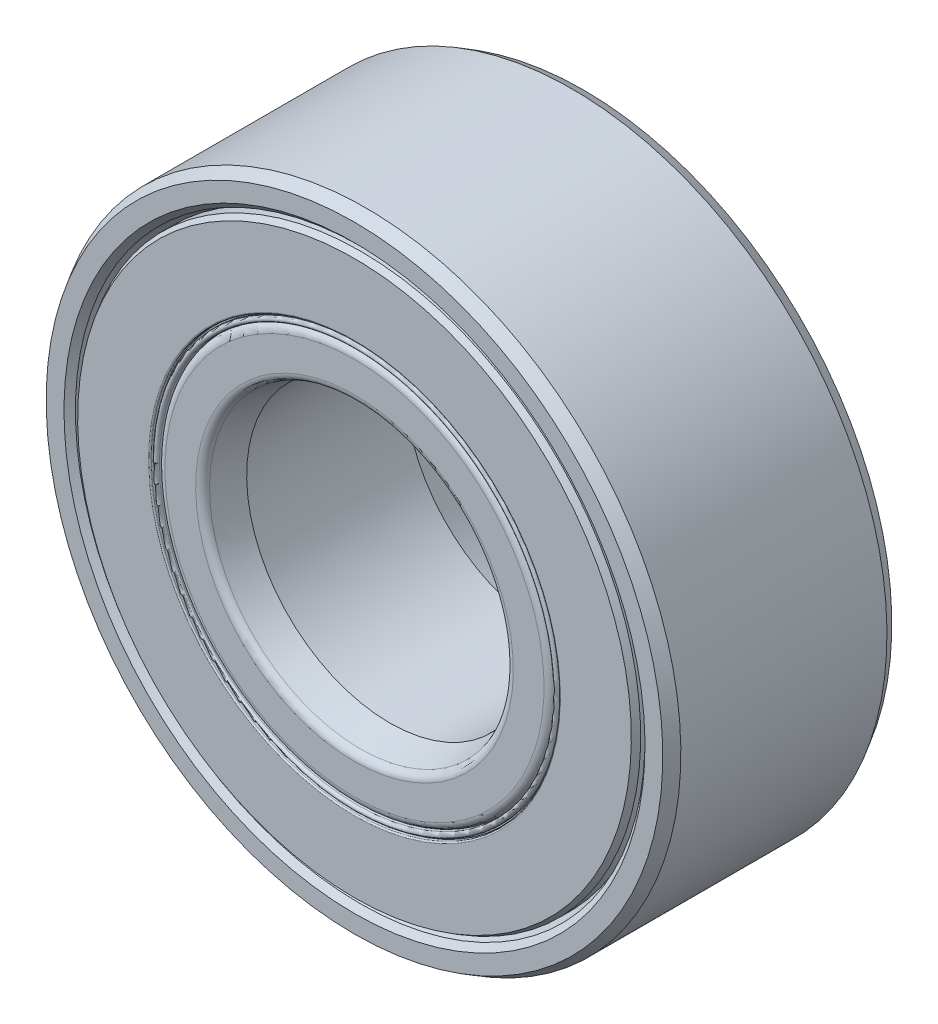
ISO-10303-21;
HEADER;
FILE_DESCRIPTION(('STEP AP214'),'2;1');
FILE_NAME('part.step','',(''),(''),'','','');
FILE_SCHEMA(('AUTOMOTIVE_DESIGN { 1 0 10303 214 1 1 1 1 }'));
ENDSEC;
DATA;
#1=APPLICATION_CONTEXT('core data for automotive mechanical design processes');
#2=APPLICATION_PROTOCOL_DEFINITION('international standard','automotive_design',2000,#1);
#3=PRODUCT_CONTEXT('',#1,'mechanical');
#4=PRODUCT('Part','Part','',(#3));
#5=PRODUCT_RELATED_PRODUCT_CATEGORY('part','',(#4));
#6=PRODUCT_DEFINITION_FORMATION('','',#4);
#7=PRODUCT_DEFINITION_CONTEXT('part definition',#1,'design');
#8=PRODUCT_DEFINITION('design','',#6,#7);
#9=PRODUCT_DEFINITION_SHAPE('','',#8);
#10=(LENGTH_UNIT() NAMED_UNIT(*) SI_UNIT(.MILLI.,.METRE.));
#11=(NAMED_UNIT(*) PLANE_ANGLE_UNIT() SI_UNIT($,.RADIAN.));
#12=(NAMED_UNIT(*) SI_UNIT($,.STERADIAN.) SOLID_ANGLE_UNIT());
#13=UNCERTAINTY_MEASURE_WITH_UNIT(LENGTH_MEASURE(1.E-05),#10,'distance_accuracy_value','');
#14=(GEOMETRIC_REPRESENTATION_CONTEXT(3) GLOBAL_UNCERTAINTY_ASSIGNED_CONTEXT((#13)) GLOBAL_UNIT_ASSIGNED_CONTEXT((#10,
#11,#12)) REPRESENTATION_CONTEXT('',''));
#15=CARTESIAN_POINT('',(0.,0.,0.));
#16=DIRECTION('',(0.,0.,1.));
#17=DIRECTION('',(1.,0.,0.));
#18=AXIS2_PLACEMENT_3D('',#15,#16,#17);
#19=CARTESIAN_POINT('',(0.,3.45166666666666,1.125));
#20=DIRECTION('',(0.,0.,1.));
#21=DIRECTION('',(0.,-1.,0.));
#22=AXIS2_PLACEMENT_3D('',#19,#20,#21);
#23=PLANE('',#22);
#24=CARTESIAN_POINT('',(0.,0.,1.125));
#25=DIRECTION('',(0.,0.,1.));
#26=DIRECTION('',(0.,-1.,0.));
#27=AXIS2_PLACEMENT_3D('',#24,#25,#26);
#28=CIRCLE('',#27,3.57166666666666);
#29=CARTESIAN_POINT('',(0.,-3.57166666666666,1.125));
#30=VERTEX_POINT('',#29);
#31=EDGE_CURVE('E11',#30,#30,#28,.T.);
#32=ORIENTED_EDGE('',*,*,#31,.F.);
#33=EDGE_LOOP('',(#32));
#34=FACE_BOUND('',#33,.T.);
#35=CARTESIAN_POINT('',(0.,0.,1.125));
#36=DIRECTION('',(0.,0.,1.));
#37=DIRECTION('',(0.,-1.,0.));
#38=AXIS2_PLACEMENT_3D('',#35,#36,#37);
#39=CIRCLE('',#38,3.45166666666666);
#40=CARTESIAN_POINT('',(0.,-3.45166666666666,1.125));
#41=VERTEX_POINT('',#40);
#42=EDGE_CURVE('E75',#41,#41,#39,.T.);
#43=ORIENTED_EDGE('',*,*,#42,.T.);
#44=EDGE_LOOP('',(#43));
#45=FACE_BOUND('',#44,.T.);
#46=ADVANCED_FACE('F50',(#34,#45),#23,.F.);
#47=CARTESIAN_POINT('',(0.,0.,2.));
#48=DIRECTION('',(0.,0.,1.));
#49=DIRECTION('',(0.,-1.,0.));
#50=AXIS2_PLACEMENT_3D('',#47,#48,#49);
#51=CYLINDRICAL_SURFACE('',#50,3.57166666666666);
#52=CARTESIAN_POINT('',(0.,0.,1.90262465990578));
#53=DIRECTION('',(0.,0.,1.));
#54=DIRECTION('',(0.,-1.,0.));
#55=AXIS2_PLACEMENT_3D('',#52,#53,#54);
#56=CIRCLE('',#55,3.57166666666667);
#57=CARTESIAN_POINT('',(0.,-3.57166666666667,1.90262465990577));
#58=VERTEX_POINT('',#57);
#59=EDGE_CURVE('E56',#58,#58,#56,.T.);
#60=ORIENTED_EDGE('',*,*,#59,.F.);
#61=EDGE_LOOP('',(#60));
#62=FACE_BOUND('',#61,.T.);
#63=ORIENTED_EDGE('',*,*,#31,.T.);
#64=EDGE_LOOP('',(#63));
#65=FACE_BOUND('',#64,.T.);
#66=ADVANCED_FACE('F106',(#62,#65),#51,.T.);
#67=CARTESIAN_POINT('',(0.,0.,1.90262465990578));
#68=DIRECTION('',(0.,0.,-1.));
#69=DIRECTION('',(0.,1.,0.));
#70=AXIS2_PLACEMENT_3D('',#67,#68,#69);
#71=CONICAL_SURFACE('',#70,3.57166666666667,0.174532925199437);
#72=CARTESIAN_POINT('',(0.,0.,1.93216889249614));
#73=DIRECTION('',(0.,0.,1.));
#74=DIRECTION('',(0.,-1.,0.));
#75=AXIS2_PLACEMENT_3D('',#72,#73,#74);
#76=CIRCLE('',#75,3.56645722133666);
#77=CARTESIAN_POINT('',(0.,-3.56645722133666,1.93216889249614));
#78=VERTEX_POINT('',#77);
#79=EDGE_CURVE('E60',#78,#78,#76,.T.);
#80=ORIENTED_EDGE('',*,*,#79,.F.);
#81=EDGE_LOOP('',(#80));
#82=FACE_BOUND('',#81,.T.);
#83=ORIENTED_EDGE('',*,*,#59,.T.);
#84=EDGE_LOOP('',(#83));
#85=FACE_BOUND('',#84,.T.);
#86=ADVANCED_FACE('F101',(#82,#85),#71,.T.);
#87=CARTESIAN_POINT('',(0.,0.,1.93));
#88=DIRECTION('',(0.,0.,1.));
#89=DIRECTION('',(0.,-1.,0.));
#90=AXIS2_PLACEMENT_3D('',#87,#88,#89);
#91=TOROIDAL_SURFACE('',#90,3.55415682075457,0.0124901540879055);
#92=CARTESIAN_POINT('',(0.,0.,1.93));
#93=DIRECTION('',(0.,0.,1.));
#94=DIRECTION('',(0.,-1.,0.));
#95=AXIS2_PLACEMENT_3D('',#92,#93,#94);
#96=CIRCLE('',#95,3.54166666666667);
#97=CARTESIAN_POINT('',(0.,-3.54166666666667,1.93));
#98=VERTEX_POINT('',#97);
#99=EDGE_CURVE('E64',#98,#98,#96,.T.);
#100=ORIENTED_EDGE('',*,*,#99,.F.);
#101=EDGE_LOOP('',(#100));
#102=FACE_BOUND('',#101,.T.);
#103=ORIENTED_EDGE('',*,*,#79,.T.);
#104=EDGE_LOOP('',(#103));
#105=FACE_BOUND('',#104,.T.);
#106=ADVANCED_FACE('F95',(#102,#105),#91,.T.);
#107=CARTESIAN_POINT('',(0.,0.,2.));
#108=DIRECTION('',(0.,0.,1.));
#109=DIRECTION('',(0.,-1.,0.));
#110=AXIS2_PLACEMENT_3D('',#107,#108,#109);
#111=CYLINDRICAL_SURFACE('',#110,3.54166666666667);
#112=CARTESIAN_POINT('',(0.,0.,1.955));
#113=DIRECTION('',(0.,0.,1.));
#114=DIRECTION('',(0.,-1.,0.));
#115=AXIS2_PLACEMENT_3D('',#112,#113,#114);
#116=CIRCLE('',#115,3.54166666666667);
#117=CARTESIAN_POINT('',(0.,-3.54166666666667,1.955));
#118=VERTEX_POINT('',#117);
#119=EDGE_CURVE('E69',#118,#118,#116,.T.);
#120=ORIENTED_EDGE('',*,*,#119,.F.);
#121=EDGE_LOOP('',(#120));
#122=FACE_BOUND('',#121,.T.);
#123=ORIENTED_EDGE('',*,*,#99,.T.);
#124=EDGE_LOOP('',(#123));
#125=FACE_BOUND('',#124,.T.);
#126=ADVANCED_FACE('F89',(#122,#125),#111,.T.);
#127=CARTESIAN_POINT('',(0.,0.,1.955));
#128=DIRECTION('',(0.,0.,1.));
#129=DIRECTION('',(0.,-1.,0.));
#130=AXIS2_PLACEMENT_3D('',#127,#128,#129);
#131=TOROIDAL_SURFACE('',#130,3.49666666666667,0.0449999999999999);
#132=CARTESIAN_POINT('',(0.,0.,1.955));
#133=DIRECTION('',(0.,0.,1.));
#134=DIRECTION('',(0.,-1.,0.));
#135=AXIS2_PLACEMENT_3D('',#132,#133,#134);
#136=CIRCLE('',#135,3.45166666666667);
#137=CARTESIAN_POINT('',(0.,-3.45166666666667,1.955));
#138=VERTEX_POINT('',#137);
#139=EDGE_CURVE('E72',#138,#138,#136,.T.);
#140=ORIENTED_EDGE('',*,*,#139,.F.);
#141=EDGE_LOOP('',(#140));
#142=FACE_BOUND('',#141,.T.);
#143=ORIENTED_EDGE('',*,*,#119,.T.);
#144=EDGE_LOOP('',(#143));
#145=FACE_BOUND('',#144,.T.);
#146=ADVANCED_FACE('F83',(#142,#145),#131,.T.);
#147=CARTESIAN_POINT('',(0.,0.,2.));
#148=DIRECTION('',(0.,0.,1.));
#149=DIRECTION('',(0.,-1.,0.));
#150=AXIS2_PLACEMENT_3D('',#147,#148,#149);
#151=CYLINDRICAL_SURFACE('',#150,3.45166666666667);
#152=ORIENTED_EDGE('',*,*,#42,.F.);
#153=EDGE_LOOP('',(#152));
#154=FACE_BOUND('',#153,.T.);
#155=ORIENTED_EDGE('',*,*,#139,.T.);
#156=EDGE_LOOP('',(#155));
#157=FACE_BOUND('',#156,.T.);
#158=ADVANCED_FACE('F80',(#154,#157),#151,.F.);
#159=CLOSED_SHELL('',(#46,#66,#86,#106,#126,#146,#158));
#160=MANIFOLD_SOLID_BREP('B2',#159);
#161=CARTESIAN_POINT('',(0.,0.,-2.));
#162=DIRECTION('',(0.,0.,1.));
#163=DIRECTION('',(0.,-1.,0.));
#164=AXIS2_PLACEMENT_3D('',#161,#162,#163);
#165=CONICAL_SURFACE('',#164,4.835,0.523598775598299);
#166=CARTESIAN_POINT('',(0.,0.,-1.89607695154587));
#167=DIRECTION('',(0.,0.,1.));
#168=DIRECTION('',(0.,-1.,0.));
#169=AXIS2_PLACEMENT_3D('',#166,#167,#168);
#170=CIRCLE('',#169,4.895);
#171=CARTESIAN_POINT('',(0.,-4.895,-1.89607695154587));
#172=VERTEX_POINT('',#171);
#173=EDGE_CURVE('E187',#172,#172,#170,.T.);
#174=ORIENTED_EDGE('',*,*,#173,.F.);
#175=EDGE_LOOP('',(#174));
#176=FACE_BOUND('',#175,.T.);
#177=CARTESIAN_POINT('',(0.,0.,-2.));
#178=DIRECTION('',(0.,0.,1.));
#179=DIRECTION('',(0.,-1.,0.));
#180=AXIS2_PLACEMENT_3D('',#177,#178,#179);
#181=CIRCLE('',#180,4.835);
#182=CARTESIAN_POINT('',(0.,-4.835,-2.));
#183=VERTEX_POINT('',#182);
#184=EDGE_CURVE('E49',#183,#183,#181,.T.);
#185=ORIENTED_EDGE('',*,*,#184,.T.);
#186=EDGE_LOOP('',(#185));
#187=FACE_BOUND('',#186,.T.);
#188=ADVANCED_FACE('F165',(#176,#187),#165,.T.);
#189=CARTESIAN_POINT('',(0.,4.835,-2.));
#190=DIRECTION('',(0.,0.,1.));
#191=DIRECTION('',(0.,-1.,0.));
#192=AXIS2_PLACEMENT_3D('',#189,#190,#191);
#193=PLANE('',#192);
#194=ORIENTED_EDGE('',*,*,#184,.F.);
#195=EDGE_LOOP('',(#194));
#196=FACE_BOUND('',#195,.T.);
#197=CARTESIAN_POINT('',(0.,0.,-2.));
#198=DIRECTION('',(0.,0.,1.));
#199=DIRECTION('',(0.,-1.,0.));
#200=AXIS2_PLACEMENT_3D('',#197,#198,#199);
#201=CIRCLE('',#200,3.59566666666667);
#202=CARTESIAN_POINT('',(0.,-3.59566666666666,-2.));
#203=VERTEX_POINT('',#202);
#204=EDGE_CURVE('E171',#203,#203,#201,.T.);
#205=ORIENTED_EDGE('',*,*,#204,.T.);
#206=EDGE_LOOP('',(#205));
#207=FACE_BOUND('',#206,.T.);
#208=ADVANCED_FACE('F194',(#196,#207),#193,.F.);
#209=CARTESIAN_POINT('',(0.,0.,-1.976));
#210=DIRECTION('',(0.,0.,1.));
#211=DIRECTION('',(0.,-1.,0.));
#212=AXIS2_PLACEMENT_3D('',#209,#210,#211);
#213=TOROIDAL_SURFACE('',#212,3.59566666666667,0.0240000000000004);
#214=ORIENTED_EDGE('',*,*,#204,.F.);
#215=EDGE_LOOP('',(#214));
#216=FACE_BOUND('',#215,.T.);
#217=CARTESIAN_POINT('',(0.,0.,-1.976));
#218=DIRECTION('',(0.,0.,1.));
#219=DIRECTION('',(0.,-1.,0.));
#220=AXIS2_PLACEMENT_3D('',#217,#218,#219);
#221=CIRCLE('',#220,3.57166666666666);
#222=CARTESIAN_POINT('',(0.,-3.57166666666666,-1.976));
#223=VERTEX_POINT('',#222);
#224=EDGE_CURVE('E175',#223,#223,#221,.T.);
#225=ORIENTED_EDGE('',*,*,#224,.T.);
#226=EDGE_LOOP('',(#225));
#227=FACE_BOUND('',#226,.T.);
#228=ADVANCED_FACE('F199',(#216,#227),#213,.T.);
#229=CARTESIAN_POINT('',(0.,0.,2.));
#230=DIRECTION('',(0.,0.,1.));
#231=DIRECTION('',(0.,-1.,0.));
#232=AXIS2_PLACEMENT_3D('',#229,#230,#231);
#233=CYLINDRICAL_SURFACE('',#232,3.57166666666666);
#234=ORIENTED_EDGE('',*,*,#224,.F.);
#235=EDGE_LOOP('',(#234));
#236=FACE_BOUND('',#235,.T.);
#237=CARTESIAN_POINT('',(0.,0.,-1.125));
#238=DIRECTION('',(0.,0.,1.));
#239=DIRECTION('',(0.,-1.,0.));
#240=AXIS2_PLACEMENT_3D('',#237,#238,#239);
#241=CIRCLE('',#240,3.57166666666666);
#242=CARTESIAN_POINT('',(0.,-3.57166666666666,-1.125));
#243=VERTEX_POINT('',#242);
#244=EDGE_CURVE('E179',#243,#243,#241,.T.);
#245=ORIENTED_EDGE('',*,*,#244,.T.);
#246=EDGE_LOOP('',(#245));
#247=FACE_BOUND('',#246,.T.);
#248=ADVANCED_FACE('F204',(#236,#247),#233,.F.);
#249=CARTESIAN_POINT('',(0.,4.895,-1.125));
#250=DIRECTION('',(0.,0.,-1.));
#251=DIRECTION('',(0.,1.,0.));
#252=AXIS2_PLACEMENT_3D('',#249,#250,#251);
#253=PLANE('',#252);
#254=ORIENTED_EDGE('',*,*,#244,.F.);
#255=EDGE_LOOP('',(#254));
#256=FACE_BOUND('',#255,.T.);
#257=CARTESIAN_POINT('',(0.,0.,-1.125));
#258=DIRECTION('',(0.,0.,1.));
#259=DIRECTION('',(0.,-1.,0.));
#260=AXIS2_PLACEMENT_3D('',#257,#258,#259);
#261=CIRCLE('',#260,4.895);
#262=CARTESIAN_POINT('',(0.,-4.895,-1.125));
#263=VERTEX_POINT('',#262);
#264=EDGE_CURVE('E184',#263,#263,#261,.T.);
#265=ORIENTED_EDGE('',*,*,#264,.T.);
#266=EDGE_LOOP('',(#265));
#267=FACE_BOUND('',#266,.T.);
#268=ADVANCED_FACE('F210',(#256,#267),#253,.F.);
#269=CARTESIAN_POINT('',(0.,0.,2.));
#270=DIRECTION('',(0.,0.,1.));
#271=DIRECTION('',(0.,-1.,0.));
#272=AXIS2_PLACEMENT_3D('',#269,#270,#271);
#273=CYLINDRICAL_SURFACE('',#272,4.895);
#274=ORIENTED_EDGE('',*,*,#264,.F.);
#275=EDGE_LOOP('',(#274));
#276=FACE_BOUND('',#275,.T.);
#277=ORIENTED_EDGE('',*,*,#173,.T.);
#278=EDGE_LOOP('',(#277));
#279=FACE_BOUND('',#278,.T.);
#280=ADVANCED_FACE('F191',(#276,#279),#273,.T.);
#281=CLOSED_SHELL('',(#188,#208,#228,#248,#268,#280));
#282=MANIFOLD_SOLID_BREP('B6',#281);
#283=CARTESIAN_POINT('',(0.,4.895,1.125));
#284=DIRECTION('',(0.,0.,1.));
#285=DIRECTION('',(0.,-1.,0.));
#286=AXIS2_PLACEMENT_3D('',#283,#284,#285);
#287=PLANE('',#286);
#288=CARTESIAN_POINT('',(0.,0.,1.125));
#289=DIRECTION('',(0.,0.,1.));
#290=DIRECTION('',(0.,-1.,0.));
#291=AXIS2_PLACEMENT_3D('',#288,#289,#290);
#292=CIRCLE('',#291,4.895);
#293=CARTESIAN_POINT('',(0.,-4.895,1.125));
#294=VERTEX_POINT('',#293);
#295=EDGE_CURVE('E164',#294,#294,#292,.T.);
#296=ORIENTED_EDGE('',*,*,#295,.F.);
#297=EDGE_LOOP('',(#296));
#298=FACE_BOUND('',#297,.T.);
#299=CARTESIAN_POINT('',(0.,0.,1.125));
#300=DIRECTION('',(0.,0.,1.));
#301=DIRECTION('',(0.,-1.,0.));
#302=AXIS2_PLACEMENT_3D('',#299,#300,#301);
#303=CIRCLE('',#302,3.57166666666666);
#304=CARTESIAN_POINT('',(0.,-3.57166666666666,1.125));
#305=VERTEX_POINT('',#304);
#306=EDGE_CURVE('E304',#305,#305,#303,.T.);
#307=ORIENTED_EDGE('',*,*,#306,.T.);
#308=EDGE_LOOP('',(#307));
#309=FACE_BOUND('',#308,.T.);
#310=ADVANCED_FACE('F282',(#298,#309),#287,.F.);
#311=CARTESIAN_POINT('',(0.,0.,2.));
#312=DIRECTION('',(0.,0.,1.));
#313=DIRECTION('',(0.,-1.,0.));
#314=AXIS2_PLACEMENT_3D('',#311,#312,#313);
#315=CYLINDRICAL_SURFACE('',#314,4.895);
#316=CARTESIAN_POINT('',(0.,0.,1.89607695154587));
#317=DIRECTION('',(0.,0.,1.));
#318=DIRECTION('',(0.,-1.,0.));
#319=AXIS2_PLACEMENT_3D('',#316,#317,#318);
#320=CIRCLE('',#319,4.895);
#321=CARTESIAN_POINT('',(0.,-4.895,1.89607695154586));
#322=VERTEX_POINT('',#321);
#323=EDGE_CURVE('E288',#322,#322,#320,.T.);
#324=ORIENTED_EDGE('',*,*,#323,.F.);
#325=EDGE_LOOP('',(#324));
#326=FACE_BOUND('',#325,.T.);
#327=ORIENTED_EDGE('',*,*,#295,.T.);
#328=EDGE_LOOP('',(#327));
#329=FACE_BOUND('',#328,.T.);
#330=ADVANCED_FACE('F329',(#326,#329),#315,.T.);
#331=CARTESIAN_POINT('',(0.,0.,1.89607695154587));
#332=DIRECTION('',(0.,0.,-1.));
#333=DIRECTION('',(0.,1.,0.));
#334=AXIS2_PLACEMENT_3D('',#331,#332,#333);
#335=CONICAL_SURFACE('',#334,4.895,0.523598775598299);
#336=CARTESIAN_POINT('',(0.,0.,2.));
#337=DIRECTION('',(0.,0.,1.));
#338=DIRECTION('',(0.,-1.,0.));
#339=AXIS2_PLACEMENT_3D('',#336,#337,#338);
#340=CIRCLE('',#339,4.835);
#341=CARTESIAN_POINT('',(0.,-4.835,2.));
#342=VERTEX_POINT('',#341);
#343=EDGE_CURVE('E292',#342,#342,#340,.T.);
#344=ORIENTED_EDGE('',*,*,#343,.F.);
#345=EDGE_LOOP('',(#344));
#346=FACE_BOUND('',#345,.T.);
#347=ORIENTED_EDGE('',*,*,#323,.T.);
#348=EDGE_LOOP('',(#347));
#349=FACE_BOUND('',#348,.T.);
#350=ADVANCED_FACE('F324',(#346,#349),#335,.T.);
#351=CARTESIAN_POINT('',(0.,4.835,2.));
#352=DIRECTION('',(0.,0.,-1.));
#353=DIRECTION('',(0.,1.,0.));
#354=AXIS2_PLACEMENT_3D('',#351,#352,#353);
#355=PLANE('',#354);
#356=CARTESIAN_POINT('',(0.,0.,2.));
#357=DIRECTION('',(0.,0.,1.));
#358=DIRECTION('',(0.,-1.,0.));
#359=AXIS2_PLACEMENT_3D('',#356,#357,#358);
#360=CIRCLE('',#359,3.59566666666667);
#361=CARTESIAN_POINT('',(0.,-3.59566666666667,2.));
#362=VERTEX_POINT('',#361);
#363=EDGE_CURVE('E296',#362,#362,#360,.T.);
#364=ORIENTED_EDGE('',*,*,#363,.F.);
#365=EDGE_LOOP('',(#364));
#366=FACE_BOUND('',#365,.T.);
#367=ORIENTED_EDGE('',*,*,#343,.T.);
#368=EDGE_LOOP('',(#367));
#369=FACE_BOUND('',#368,.T.);
#370=ADVANCED_FACE('F318',(#366,#369),#355,.F.);
#371=CARTESIAN_POINT('',(0.,0.,1.976));
#372=DIRECTION('',(0.,0.,1.));
#373=DIRECTION('',(0.,-1.,0.));
#374=AXIS2_PLACEMENT_3D('',#371,#372,#373);
#375=TOROIDAL_SURFACE('',#374,3.59566666666667,0.0240000000000004);
#376=CARTESIAN_POINT('',(0.,0.,1.976));
#377=DIRECTION('',(0.,0.,1.));
#378=DIRECTION('',(0.,-1.,0.));
#379=AXIS2_PLACEMENT_3D('',#376,#377,#378);
#380=CIRCLE('',#379,3.57166666666667);
#381=CARTESIAN_POINT('',(0.,-3.57166666666667,1.976));
#382=VERTEX_POINT('',#381);
#383=EDGE_CURVE('E301',#382,#382,#380,.T.);
#384=ORIENTED_EDGE('',*,*,#383,.F.);
#385=EDGE_LOOP('',(#384));
#386=FACE_BOUND('',#385,.T.);
#387=ORIENTED_EDGE('',*,*,#363,.T.);
#388=EDGE_LOOP('',(#387));
#389=FACE_BOUND('',#388,.T.);
#390=ADVANCED_FACE('F312',(#386,#389),#375,.T.);
#391=CARTESIAN_POINT('',(0.,0.,2.));
#392=DIRECTION('',(0.,0.,1.));
#393=DIRECTION('',(0.,-1.,0.));
#394=AXIS2_PLACEMENT_3D('',#391,#392,#393);
#395=CYLINDRICAL_SURFACE('',#394,3.57166666666666);
#396=ORIENTED_EDGE('',*,*,#306,.F.);
#397=EDGE_LOOP('',(#396));
#398=FACE_BOUND('',#397,.T.);
#399=ORIENTED_EDGE('',*,*,#383,.T.);
#400=EDGE_LOOP('',(#399));
#401=FACE_BOUND('',#400,.T.);
#402=ADVANCED_FACE('F309',(#398,#401),#395,.F.);
#403=CLOSED_SHELL('',(#310,#330,#350,#370,#390,#402));
#404=MANIFOLD_SOLID_BREP('B44',#403);
#405=CARTESIAN_POINT('',(-2.68256695775845,3.19695880928323,0.));
#406=DIRECTION('',(0.,0.,1.));
#407=DIRECTION('',(-0.64278760968653,0.766044443118986,0.));
#408=AXIS2_PLACEMENT_3D('',#405,#406,#407);
#409=SPHERICAL_SURFACE('',#408,1.125);
#410=CARTESIAN_POINT('',(-2.68256695775845,3.19695880928323,1.125));
#411=VERTEX_POINT('',#410);
#412=VERTEX_LOOP('',#411);
#413=FACE_BOUND('',#412,.T.);
#414=ADVANCED_FACE('F399',(#413),#409,.T.);
#415=CLOSED_SHELL('',(#414));
#416=MANIFOLD_SOLID_BREP('B159',#415);
#417=CARTESIAN_POINT('',(-4.10993102257094,0.724691728130031,0.));
#418=DIRECTION('',(0.,0.,1.));
#419=DIRECTION('',(-0.984807753012206,0.17364817766694,0.));
#420=AXIS2_PLACEMENT_3D('',#417,#418,#419);
#421=SPHERICAL_SURFACE('',#420,1.125);
#422=CARTESIAN_POINT('',(-4.10993102257094,0.724691728130031,1.125));
#423=VERTEX_POINT('',#422);
#424=VERTEX_LOOP('',#423);
#425=FACE_BOUND('',#424,.T.);
#426=ADVANCED_FACE('F418',(#425),#421,.T.);
#427=CLOSED_SHELL('',(#426));
#428=MANIFOLD_SOLID_BREP('B278',#427);
#429=CARTESIAN_POINT('',(-3.61421268512708,-2.08666666666663,0.));
#430=DIRECTION('',(0.,0.,1.));
#431=DIRECTION('',(-0.866025403784443,-0.499999999999992,0.));
#432=AXIS2_PLACEMENT_3D('',#429,#430,#431);
#433=SPHERICAL_SURFACE('',#432,1.125);
#434=CARTESIAN_POINT('',(-3.61421268512708,-2.08666666666663,1.125));
#435=VERTEX_POINT('',#434);
#436=VERTEX_LOOP('',#435);
#437=FACE_BOUND('',#436,.T.);
#438=ADVANCED_FACE('F437',(#437),#433,.T.);
#439=CLOSED_SHELL('',(#438));
#440=MANIFOLD_SOLID_BREP('B395',#439);
#441=CARTESIAN_POINT('',(-1.42736406481249,-3.92165053741318,0.));
#442=DIRECTION('',(0.,0.,1.));
#443=DIRECTION('',(-0.342020143325676,-0.939692620785906,0.));
#444=AXIS2_PLACEMENT_3D('',#441,#442,#443);
#445=SPHERICAL_SURFACE('',#444,1.125);
#446=CARTESIAN_POINT('',(-1.42736406481249,-3.92165053741318,1.125));
#447=VERTEX_POINT('',#446);
#448=VERTEX_LOOP('',#447);
#449=FACE_BOUND('',#448,.T.);
#450=ADVANCED_FACE('F456',(#449),#445,.T.);
#451=CLOSED_SHELL('',(#450));
#452=MANIFOLD_SOLID_BREP('B414',#451);
#453=CARTESIAN_POINT('',(1.42736406481243,-3.9216505374132,0.));
#454=DIRECTION('',(0.,0.,1.));
#455=DIRECTION('',(0.342020143325663,-0.939692620785911,0.));
#456=AXIS2_PLACEMENT_3D('',#453,#454,#455);
#457=SPHERICAL_SURFACE('',#456,1.125);
#458=CARTESIAN_POINT('',(1.42736406481243,-3.9216505374132,1.125));
#459=VERTEX_POINT('',#458);
#460=VERTEX_LOOP('',#459);
#461=FACE_BOUND('',#460,.T.);
#462=ADVANCED_FACE('F475',(#461),#457,.T.);
#463=CLOSED_SHELL('',(#462));
#464=MANIFOLD_SOLID_BREP('B433',#463);
#465=CARTESIAN_POINT('',(3.61421268512705,-2.08666666666668,0.));
#466=DIRECTION('',(0.,0.,1.));
#467=DIRECTION('',(0.866025403784436,-0.500000000000004,0.));
#468=AXIS2_PLACEMENT_3D('',#465,#466,#467);
#469=SPHERICAL_SURFACE('',#468,1.125);
#470=CARTESIAN_POINT('',(3.61421268512705,-2.08666666666668,1.125));
#471=VERTEX_POINT('',#470);
#472=VERTEX_LOOP('',#471);
#473=FACE_BOUND('',#472,.T.);
#474=ADVANCED_FACE('F494',(#473),#469,.T.);
#475=CLOSED_SHELL('',(#474));
#476=MANIFOLD_SOLID_BREP('B452',#475);
#477=CARTESIAN_POINT('',(4.10993102257095,0.724691728129977,0.));
#478=DIRECTION('',(0.,0.,1.));
#479=DIRECTION('',(0.984807753012209,0.173648177666927,0.));
#480=AXIS2_PLACEMENT_3D('',#477,#478,#479);
#481=SPHERICAL_SURFACE('',#480,1.125);
#482=CARTESIAN_POINT('',(4.10993102257095,0.724691728129977,1.125));
#483=VERTEX_POINT('',#482);
#484=VERTEX_LOOP('',#483);
#485=FACE_BOUND('',#484,.T.);
#486=ADVANCED_FACE('F513',(#485),#481,.T.);
#487=CLOSED_SHELL('',(#486));
#488=MANIFOLD_SOLID_BREP('B471',#487);
#489=CARTESIAN_POINT('',(2.6825669577585,3.1969588092832,0.));
#490=DIRECTION('',(0.,0.,1.));
#491=DIRECTION('',(0.642787609686541,0.766044443118977,0.));
#492=AXIS2_PLACEMENT_3D('',#489,#490,#491);
#493=SPHERICAL_SURFACE('',#492,1.125);
#494=CARTESIAN_POINT('',(2.6825669577585,3.1969588092832,1.125));
#495=VERTEX_POINT('',#494);
#496=VERTEX_LOOP('',#495);
#497=FACE_BOUND('',#496,.T.);
#498=ADVANCED_FACE('F532',(#497),#493,.T.);
#499=CLOSED_SHELL('',(#498));
#500=MANIFOLD_SOLID_BREP('B490',#499);
#501=CARTESIAN_POINT('',(0.,4.17333333333333,0.));
#502=DIRECTION('',(0.,0.,1.));
#503=DIRECTION('',(0.,1.,0.));
#504=AXIS2_PLACEMENT_3D('',#501,#502,#503);
#505=SPHERICAL_SURFACE('',#504,1.125);
#506=CARTESIAN_POINT('',(0.,4.17333333333333,1.125));
#507=VERTEX_POINT('',#506);
#508=VERTEX_LOOP('',#507);
#509=FACE_BOUND('',#508,.T.);
#510=ADVANCED_FACE('F553',(#509),#505,.T.);
#511=CLOSED_SHELL('',(#510));
#512=MANIFOLD_SOLID_BREP('B509',#511);
#513=CARTESIAN_POINT('',(0.,0.,-1.85808089026878));
#514=DIRECTION('',(0.,0.,1.));
#515=DIRECTION('',(0.,-1.,0.));
#516=AXIS2_PLACEMENT_3D('',#513,#514,#515);
#517=TOROIDAL_SURFACE('',#516,2.77416666666667,0.141919109731215);
#518=CARTESIAN_POINT('',(0.,0.,-2.));
#519=DIRECTION('',(0.,0.,1.));
#520=DIRECTION('',(0.,-1.,0.));
#521=AXIS2_PLACEMENT_3D('',#518,#519,#520);
#522=CIRCLE('',#521,2.77416666666667);
#523=CARTESIAN_POINT('',(0.,-2.77416666666666,-2.));
#524=VERTEX_POINT('',#523);
#525=EDGE_CURVE('E552',#524,#524,#522,.T.);
#526=ORIENTED_EDGE('',*,*,#525,.F.);
#527=EDGE_LOOP('',(#526));
#528=FACE_BOUND('',#527,.T.);
#529=CARTESIAN_POINT('',(0.,0.,-1.89481225873122));
#530=DIRECTION('',(0.,0.,1.));
#531=DIRECTION('',(0.,-1.,0.));
#532=AXIS2_PLACEMENT_3D('',#529,#530,#531);
#533=CIRCLE('',#532,2.63708333333333);
#534=CARTESIAN_POINT('',(0.,-2.63708333333333,-1.89481225873122));
#535=VERTEX_POINT('',#534);
#536=EDGE_CURVE('E613',#535,#535,#533,.T.);
#537=ORIENTED_EDGE('',*,*,#536,.T.);
#538=EDGE_LOOP('',(#537));
#539=FACE_BOUND('',#538,.T.);
#540=ADVANCED_FACE('F573',(#528,#539),#517,.T.);
#541=CARTESIAN_POINT('',(0.,2.77416666666667,-2.));
#542=DIRECTION('',(0.,0.,1.));
#543=DIRECTION('',(0.,-1.,0.));
#544=AXIS2_PLACEMENT_3D('',#541,#542,#543);
#545=PLANE('',#544);
#546=CARTESIAN_POINT('',(0.,0.,-2.));
#547=DIRECTION('',(0.,0.,1.));
#548=DIRECTION('',(0.,-1.,0.));
#549=AXIS2_PLACEMENT_3D('',#546,#547,#548);
#550=CIRCLE('',#549,3.30974755693545);
#551=CARTESIAN_POINT('',(0.,-3.30974755693545,-2.));
#552=VERTEX_POINT('',#551);
#553=EDGE_CURVE('E579',#552,#552,#550,.T.);
#554=ORIENTED_EDGE('',*,*,#553,.F.);
#555=EDGE_LOOP('',(#554));
#556=FACE_BOUND('',#555,.T.);
#557=ORIENTED_EDGE('',*,*,#525,.T.);
#558=EDGE_LOOP('',(#557));
#559=FACE_BOUND('',#558,.T.);
#560=ADVANCED_FACE('F674',(#556,#559),#545,.F.);
#561=CARTESIAN_POINT('',(0.,0.,-1.85808089026878));
#562=DIRECTION('',(0.,0.,1.));
#563=DIRECTION('',(0.,-1.,0.));
#564=AXIS2_PLACEMENT_3D('',#561,#562,#563);
#565=TOROIDAL_SURFACE('',#564,3.30974755693545,0.141919109731215);
#566=CARTESIAN_POINT('',(0.,0.,-1.85808089026878));
#567=DIRECTION('',(0.,0.,1.));
#568=DIRECTION('',(0.,-1.,0.));
#569=AXIS2_PLACEMENT_3D('',#566,#567,#568);
#570=CIRCLE('',#569,3.45166666666666);
#571=CARTESIAN_POINT('',(0.,-3.45166666666666,-1.85808089026878));
#572=VERTEX_POINT('',#571);
#573=EDGE_CURVE('E583',#572,#572,#570,.T.);
#574=ORIENTED_EDGE('',*,*,#573,.F.);
#575=EDGE_LOOP('',(#574));
#576=FACE_BOUND('',#575,.T.);
#577=ORIENTED_EDGE('',*,*,#553,.T.);
#578=EDGE_LOOP('',(#577));
#579=FACE_BOUND('',#578,.T.);
#580=ADVANCED_FACE('F669',(#576,#579),#565,.T.);
#581=CARTESIAN_POINT('',(0.,0.,2.));
#582=DIRECTION('',(0.,0.,1.));
#583=DIRECTION('',(0.,-1.,0.));
#584=AXIS2_PLACEMENT_3D('',#581,#582,#583);
#585=CYLINDRICAL_SURFACE('',#584,3.45166666666666);
#586=CARTESIAN_POINT('',(0.,0.,-0.863030835035587));
#587=DIRECTION('',(0.,0.,1.));
#588=DIRECTION('',(0.,-1.,0.));
#589=AXIS2_PLACEMENT_3D('',#586,#587,#588);
#590=CIRCLE('',#589,3.45166666666666);
#591=CARTESIAN_POINT('',(0.,-3.45166666666666,-0.863030835035587));
#592=VERTEX_POINT('',#591);
#593=EDGE_CURVE('E587',#592,#592,#590,.T.);
#594=ORIENTED_EDGE('',*,*,#593,.F.);
#595=EDGE_LOOP('',(#594));
#596=FACE_BOUND('',#595,.T.);
#597=ORIENTED_EDGE('',*,*,#573,.T.);
#598=EDGE_LOOP('',(#597));
#599=FACE_BOUND('',#598,.T.);
#600=ADVANCED_FACE('F663',(#596,#599),#585,.T.);
#601=CARTESIAN_POINT('',(0.,0.,0.));
#602=DIRECTION('',(0.,0.,1.));
#603=DIRECTION('',(0.,-1.,0.));
#604=AXIS2_PLACEMENT_3D('',#601,#602,#603);
#605=TOROIDAL_SURFACE('',#604,4.17333333333333,1.125);
#606=CARTESIAN_POINT('',(0.,0.,0.863030835035584));
#607=DIRECTION('',(0.,0.,1.));
#608=DIRECTION('',(0.,-1.,0.));
#609=AXIS2_PLACEMENT_3D('',#606,#607,#608);
#610=CIRCLE('',#609,3.45166666666667);
#611=CARTESIAN_POINT('',(0.,-3.45166666666667,0.863030835035584));
#612=VERTEX_POINT('',#611);
#613=EDGE_CURVE('E592',#612,#612,#610,.T.);
#614=ORIENTED_EDGE('',*,*,#613,.F.);
#615=EDGE_LOOP('',(#614));
#616=FACE_BOUND('',#615,.T.);
#617=ORIENTED_EDGE('',*,*,#593,.T.);
#618=EDGE_LOOP('',(#617));
#619=FACE_BOUND('',#618,.T.);
#620=ADVANCED_FACE('F657',(#616,#619),#605,.F.);
#621=CARTESIAN_POINT('',(0.,0.,2.));
#622=DIRECTION('',(0.,0.,1.));
#623=DIRECTION('',(0.,-1.,0.));
#624=AXIS2_PLACEMENT_3D('',#621,#622,#623);
#625=CYLINDRICAL_SURFACE('',#624,3.45166666666667);
#626=CARTESIAN_POINT('',(0.,0.,1.85808089026878));
#627=DIRECTION('',(0.,0.,1.));
#628=DIRECTION('',(0.,-1.,0.));
#629=AXIS2_PLACEMENT_3D('',#626,#627,#628);
#630=CIRCLE('',#629,3.45166666666667);
#631=CARTESIAN_POINT('',(0.,-3.45166666666667,1.85808089026878));
#632=VERTEX_POINT('',#631);
#633=EDGE_CURVE('E595',#632,#632,#630,.T.);
#634=ORIENTED_EDGE('',*,*,#633,.F.);
#635=EDGE_LOOP('',(#634));
#636=FACE_BOUND('',#635,.T.);
#637=ORIENTED_EDGE('',*,*,#613,.T.);
#638=EDGE_LOOP('',(#637));
#639=FACE_BOUND('',#638,.T.);
#640=ADVANCED_FACE('F651',(#636,#639),#625,.T.);
#641=CARTESIAN_POINT('',(0.,0.,1.85808089026878));
#642=DIRECTION('',(0.,0.,1.));
#643=DIRECTION('',(0.,-1.,0.));
#644=AXIS2_PLACEMENT_3D('',#641,#642,#643);
#645=TOROIDAL_SURFACE('',#644,3.30974755693545,0.141919109731215);
#646=CARTESIAN_POINT('',(0.,0.,2.));
#647=DIRECTION('',(0.,0.,1.));
#648=DIRECTION('',(0.,-1.,0.));
#649=AXIS2_PLACEMENT_3D('',#646,#647,#648);
#650=CIRCLE('',#649,3.30974755693545);
#651=CARTESIAN_POINT('',(0.,-3.30974755693545,2.));
#652=VERTEX_POINT('',#651);
#653=EDGE_CURVE('E598',#652,#652,#650,.T.);
#654=ORIENTED_EDGE('',*,*,#653,.F.);
#655=EDGE_LOOP('',(#654));
#656=FACE_BOUND('',#655,.T.);
#657=ORIENTED_EDGE('',*,*,#633,.T.);
#658=EDGE_LOOP('',(#657));
#659=FACE_BOUND('',#658,.T.);
#660=ADVANCED_FACE('F645',(#656,#659),#645,.T.);
#661=CARTESIAN_POINT('',(0.,2.77416666666667,2.));
#662=DIRECTION('',(0.,0.,-1.));
#663=DIRECTION('',(0.,1.,0.));
#664=AXIS2_PLACEMENT_3D('',#661,#662,#663);
#665=PLANE('',#664);
#666=CARTESIAN_POINT('',(0.,0.,2.));
#667=DIRECTION('',(0.,0.,1.));
#668=DIRECTION('',(0.,-1.,0.));
#669=AXIS2_PLACEMENT_3D('',#666,#667,#668);
#670=CIRCLE('',#669,2.77416666666667);
#671=CARTESIAN_POINT('',(0.,-2.77416666666667,2.));
#672=VERTEX_POINT('',#671);
#673=EDGE_CURVE('E601',#672,#672,#670,.T.);
#674=ORIENTED_EDGE('',*,*,#673,.F.);
#675=EDGE_LOOP('',(#674));
#676=FACE_BOUND('',#675,.T.);
#677=ORIENTED_EDGE('',*,*,#653,.T.);
#678=EDGE_LOOP('',(#677));
#679=FACE_BOUND('',#678,.T.);
#680=ADVANCED_FACE('F639',(#676,#679),#665,.F.);
#681=CARTESIAN_POINT('',(0.,0.,1.85808089026878));
#682=DIRECTION('',(0.,0.,1.));
#683=DIRECTION('',(0.,-1.,0.));
#684=AXIS2_PLACEMENT_3D('',#681,#682,#683);
#685=TOROIDAL_SURFACE('',#684,2.77416666666667,0.141919109731215);
#686=CARTESIAN_POINT('',(0.,0.,1.89481225873122));
#687=DIRECTION('',(0.,0.,1.));
#688=DIRECTION('',(0.,-1.,0.));
#689=AXIS2_PLACEMENT_3D('',#686,#687,#688);
#690=CIRCLE('',#689,2.63708333333333);
#691=CARTESIAN_POINT('',(0.,-2.63708333333333,1.89481225873122));
#692=VERTEX_POINT('',#691);
#693=EDGE_CURVE('E604',#692,#692,#690,.T.);
#694=ORIENTED_EDGE('',*,*,#693,.F.);
#695=EDGE_LOOP('',(#694));
#696=FACE_BOUND('',#695,.T.);
#697=ORIENTED_EDGE('',*,*,#673,.T.);
#698=EDGE_LOOP('',(#697));
#699=FACE_BOUND('',#698,.T.);
#700=ADVANCED_FACE('F633',(#696,#699),#685,.T.);
#701=CARTESIAN_POINT('',(0.,0.,1.89481225873122));
#702=DIRECTION('',(0.,0.,1.));
#703=DIRECTION('',(0.,-1.,0.));
#704=AXIS2_PLACEMENT_3D('',#701,#702,#703);
#705=CONICAL_SURFACE('',#704,2.63708333333333,0.26179938779915);
#706=CARTESIAN_POINT('',(0.,0.,1.38321029386032));
#707=DIRECTION('',(0.,0.,1.));
#708=DIRECTION('',(0.,-1.,0.));
#709=AXIS2_PLACEMENT_3D('',#706,#707,#708);
#710=CIRCLE('',#709,2.5);
#711=CARTESIAN_POINT('',(0.,-2.5,1.38321029386032));
#712=VERTEX_POINT('',#711);
#713=EDGE_CURVE('E607',#712,#712,#710,.T.);
#714=ORIENTED_EDGE('',*,*,#713,.F.);
#715=EDGE_LOOP('',(#714));
#716=FACE_BOUND('',#715,.T.);
#717=ORIENTED_EDGE('',*,*,#693,.T.);
#718=EDGE_LOOP('',(#717));
#719=FACE_BOUND('',#718,.T.);
#720=ADVANCED_FACE('F627',(#716,#719),#705,.F.);
#721=CARTESIAN_POINT('',(0.,0.,2.));
#722=DIRECTION('',(0.,0.,1.));
#723=DIRECTION('',(0.,-1.,0.));
#724=AXIS2_PLACEMENT_3D('',#721,#722,#723);
#725=CYLINDRICAL_SURFACE('',#724,2.5);
#726=CARTESIAN_POINT('',(0.,0.,-1.38321029386032));
#727=DIRECTION('',(0.,0.,1.));
#728=DIRECTION('',(0.,-1.,0.));
#729=AXIS2_PLACEMENT_3D('',#726,#727,#728);
#730=CIRCLE('',#729,2.5);
#731=CARTESIAN_POINT('',(0.,-2.5,-1.38321029386032));
#732=VERTEX_POINT('',#731);
#733=EDGE_CURVE('E610',#732,#732,#730,.T.);
#734=ORIENTED_EDGE('',*,*,#733,.F.);
#735=EDGE_LOOP('',(#734));
#736=FACE_BOUND('',#735,.T.);
#737=ORIENTED_EDGE('',*,*,#713,.T.);
#738=EDGE_LOOP('',(#737));
#739=FACE_BOUND('',#738,.T.);
#740=ADVANCED_FACE('F621',(#736,#739),#725,.F.);
#741=CARTESIAN_POINT('',(0.,0.,-1.38321029386032));
#742=DIRECTION('',(0.,0.,-1.));
#743=DIRECTION('',(0.,1.,0.));
#744=AXIS2_PLACEMENT_3D('',#741,#742,#743);
#745=CONICAL_SURFACE('',#744,2.5,0.261799387799149);
#746=ORIENTED_EDGE('',*,*,#536,.F.);
#747=EDGE_LOOP('',(#746));
#748=FACE_BOUND('',#747,.T.);
#749=ORIENTED_EDGE('',*,*,#733,.T.);
#750=EDGE_LOOP('',(#749));
#751=FACE_BOUND('',#750,.T.);
#752=ADVANCED_FACE('F618',(#748,#751),#745,.F.);
#753=CLOSED_SHELL('',(#540,#560,#580,#600,#620,#640,#660,#680,#700,#720,#740,#752));
#754=MANIFOLD_SOLID_BREP('B528',#753);
#755=CARTESIAN_POINT('',(0.,0.,2.));
#756=DIRECTION('',(0.,0.,1.));
#757=DIRECTION('',(0.,-1.,0.));
#758=AXIS2_PLACEMENT_3D('',#755,#756,#757);
#759=CYLINDRICAL_SURFACE('',#758,4.895);
#760=CARTESIAN_POINT('',(0.,0.,0.863030835035583));
#761=DIRECTION('',(0.,0.,1.));
#762=DIRECTION('',(0.,-1.,0.));
#763=AXIS2_PLACEMENT_3D('',#760,#761,#762);
#764=CIRCLE('',#763,4.895);
#765=CARTESIAN_POINT('',(0.,-4.895,0.863030835035582));
#766=VERTEX_POINT('',#765);
#767=EDGE_CURVE('E572',#766,#766,#764,.T.);
#768=ORIENTED_EDGE('',*,*,#767,.F.);
#769=EDGE_LOOP('',(#768));
#770=FACE_BOUND('',#769,.T.);
#771=CARTESIAN_POINT('',(0.,0.,1.6829872849735));
#772=DIRECTION('',(0.,0.,1.));
#773=DIRECTION('',(0.,-1.,0.));
#774=AXIS2_PLACEMENT_3D('',#771,#772,#773);
#775=CIRCLE('',#774,4.895);
#776=CARTESIAN_POINT('',(0.,-4.895,1.6829872849735));
#777=VERTEX_POINT('',#776);
#778=EDGE_CURVE('E795',#777,#777,#775,.T.);
#779=ORIENTED_EDGE('',*,*,#778,.T.);
#780=EDGE_LOOP('',(#779));
#781=FACE_BOUND('',#780,.T.);
#782=ADVANCED_FACE('F755',(#770,#781),#759,.F.);
#783=CARTESIAN_POINT('',(0.,0.,0.));
#784=DIRECTION('',(0.,0.,1.));
#785=DIRECTION('',(0.,-1.,0.));
#786=AXIS2_PLACEMENT_3D('',#783,#784,#785);
#787=TOROIDAL_SURFACE('',#786,4.17333333333333,1.125);
#788=CARTESIAN_POINT('',(0.,0.,-0.863030835035586));
#789=DIRECTION('',(0.,0.,1.));
#790=DIRECTION('',(0.,-1.,0.));
#791=AXIS2_PLACEMENT_3D('',#788,#789,#790);
#792=CIRCLE('',#791,4.895);
#793=CARTESIAN_POINT('',(0.,-4.895,-0.863030835035587));
#794=VERTEX_POINT('',#793);
#795=EDGE_CURVE('E761',#794,#794,#792,.T.);
#796=ORIENTED_EDGE('',*,*,#795,.F.);
#797=EDGE_LOOP('',(#796));
#798=FACE_BOUND('',#797,.T.);
#799=ORIENTED_EDGE('',*,*,#767,.T.);
#800=EDGE_LOOP('',(#799));
#801=FACE_BOUND('',#800,.T.);
#802=ADVANCED_FACE('F856',(#798,#801),#787,.F.);
#803=CARTESIAN_POINT('',(0.,0.,2.));
#804=DIRECTION('',(0.,0.,1.));
#805=DIRECTION('',(0.,-1.,0.));
#806=AXIS2_PLACEMENT_3D('',#803,#804,#805);
#807=CYLINDRICAL_SURFACE('',#806,4.895);
#808=CARTESIAN_POINT('',(0.,0.,-1.6829872849735));
#809=DIRECTION('',(0.,0.,1.));
#810=DIRECTION('',(0.,-1.,0.));
#811=AXIS2_PLACEMENT_3D('',#808,#809,#810);
#812=CIRCLE('',#811,4.895);
#813=CARTESIAN_POINT('',(0.,-4.895,-1.6829872849735));
#814=VERTEX_POINT('',#813);
#815=EDGE_CURVE('E765',#814,#814,#812,.T.);
#816=ORIENTED_EDGE('',*,*,#815,.F.);
#817=EDGE_LOOP('',(#816));
#818=FACE_BOUND('',#817,.T.);
#819=ORIENTED_EDGE('',*,*,#795,.T.);
#820=EDGE_LOOP('',(#819));
#821=FACE_BOUND('',#820,.T.);
#822=ADVANCED_FACE('F851',(#818,#821),#807,.F.);
#823=CARTESIAN_POINT('',(0.,0.,-1.6829872849735));
#824=DIRECTION('',(0.,0.,-1.));
#825=DIRECTION('',(0.,1.,0.));
#826=AXIS2_PLACEMENT_3D('',#823,#824,#825);
#827=CONICAL_SURFACE('',#826,4.895,0.349065850398864);
#828=CARTESIAN_POINT('',(0.,0.,-1.9));
#829=DIRECTION('',(0.,0.,1.));
#830=DIRECTION('',(0.,-1.,0.));
#831=AXIS2_PLACEMENT_3D('',#828,#829,#830);
#832=CIRCLE('',#831,4.97398616872694);
#833=CARTESIAN_POINT('',(0.,-4.97398616872694,-1.9));
#834=VERTEX_POINT('',#833);
#835=EDGE_CURVE('E769',#834,#834,#832,.T.);
#836=ORIENTED_EDGE('',*,*,#835,.F.);
#837=EDGE_LOOP('',(#836));
#838=FACE_BOUND('',#837,.T.);
#839=ORIENTED_EDGE('',*,*,#815,.T.);
#840=EDGE_LOOP('',(#839));
#841=FACE_BOUND('',#840,.T.);
#842=ADVANCED_FACE('F845',(#838,#841),#827,.F.);
#843=CARTESIAN_POINT('',(0.,0.,-1.9));
#844=DIRECTION('',(0.,0.,-1.));
#845=DIRECTION('',(0.,1.,0.));
#846=AXIS2_PLACEMENT_3D('',#843,#844,#845);
#847=CONICAL_SURFACE('',#846,4.97398616872694,0.785398163397444);
#848=CARTESIAN_POINT('',(0.,0.,-2.));
#849=DIRECTION('',(0.,0.,1.));
#850=DIRECTION('',(0.,-1.,0.));
#851=AXIS2_PLACEMENT_3D('',#848,#849,#850);
#852=CIRCLE('',#851,5.07398616872694);
#853=CARTESIAN_POINT('',(0.,-5.07398616872694,-2.));
#854=VERTEX_POINT('',#853);
#855=EDGE_CURVE('E774',#854,#854,#852,.T.);
#856=ORIENTED_EDGE('',*,*,#855,.F.);
#857=EDGE_LOOP('',(#856));
#858=FACE_BOUND('',#857,.T.);
#859=ORIENTED_EDGE('',*,*,#835,.T.);
#860=EDGE_LOOP('',(#859));
#861=FACE_BOUND('',#860,.T.);
#862=ADVANCED_FACE('F839',(#858,#861),#847,.F.);
#863=CARTESIAN_POINT('',(0.,5.38452994616208,-2.));
#864=DIRECTION('',(0.,0.,1.));
#865=DIRECTION('',(0.,-1.,0.));
#866=AXIS2_PLACEMENT_3D('',#863,#864,#865);
#867=PLANE('',#866);
#868=CARTESIAN_POINT('',(0.,0.,-2.));
#869=DIRECTION('',(0.,0.,1.));
#870=DIRECTION('',(0.,-1.,0.));
#871=AXIS2_PLACEMENT_3D('',#868,#869,#870);
#872=CIRCLE('',#871,5.38452994616207);
#873=CARTESIAN_POINT('',(0.,-5.38452994616207,-2.));
#874=VERTEX_POINT('',#873);
#875=EDGE_CURVE('E777',#874,#874,#872,.T.);
#876=ORIENTED_EDGE('',*,*,#875,.F.);
#877=EDGE_LOOP('',(#876));
#878=FACE_BOUND('',#877,.T.);
#879=ORIENTED_EDGE('',*,*,#855,.T.);
#880=EDGE_LOOP('',(#879));
#881=FACE_BOUND('',#880,.T.);
#882=ADVANCED_FACE('F833',(#878,#881),#867,.F.);
#883=CARTESIAN_POINT('',(0.,0.,-2.));
#884=DIRECTION('',(0.,0.,1.));
#885=DIRECTION('',(0.,-1.,0.));
#886=AXIS2_PLACEMENT_3D('',#883,#884,#885);
#887=CONICAL_SURFACE('',#886,5.38452994616207,0.523598775598295);
#888=CARTESIAN_POINT('',(0.,0.,-1.8));
#889=DIRECTION('',(0.,0.,1.));
#890=DIRECTION('',(0.,-1.,0.));
#891=AXIS2_PLACEMENT_3D('',#888,#889,#890);
#892=CIRCLE('',#891,5.5);
#893=CARTESIAN_POINT('',(0.,-5.5,-1.8));
#894=VERTEX_POINT('',#893);
#895=EDGE_CURVE('E780',#894,#894,#892,.T.);
#896=ORIENTED_EDGE('',*,*,#895,.F.);
#897=EDGE_LOOP('',(#896));
#898=FACE_BOUND('',#897,.T.);
#899=ORIENTED_EDGE('',*,*,#875,.T.);
#900=EDGE_LOOP('',(#899));
#901=FACE_BOUND('',#900,.T.);
#902=ADVANCED_FACE('F827',(#898,#901),#887,.T.);
#903=CARTESIAN_POINT('',(0.,0.,2.));
#904=DIRECTION('',(0.,0.,1.));
#905=DIRECTION('',(0.,-1.,0.));
#906=AXIS2_PLACEMENT_3D('',#903,#904,#905);
#907=CYLINDRICAL_SURFACE('',#906,5.5);
#908=CARTESIAN_POINT('',(0.,0.,1.8));
#909=DIRECTION('',(0.,0.,1.));
#910=DIRECTION('',(0.,-1.,0.));
#911=AXIS2_PLACEMENT_3D('',#908,#909,#910);
#912=CIRCLE('',#911,5.5);
#913=CARTESIAN_POINT('',(0.,-5.5,1.8));
#914=VERTEX_POINT('',#913);
#915=EDGE_CURVE('E783',#914,#914,#912,.T.);
#916=ORIENTED_EDGE('',*,*,#915,.F.);
#917=EDGE_LOOP('',(#916));
#918=FACE_BOUND('',#917,.T.);
#919=ORIENTED_EDGE('',*,*,#895,.T.);
#920=EDGE_LOOP('',(#919));
#921=FACE_BOUND('',#920,.T.);
#922=ADVANCED_FACE('F821',(#918,#921),#907,.T.);
#923=CARTESIAN_POINT('',(0.,0.,1.8));
#924=DIRECTION('',(0.,0.,-1.));
#925=DIRECTION('',(0.,1.,0.));
#926=AXIS2_PLACEMENT_3D('',#923,#924,#925);
#927=CONICAL_SURFACE('',#926,5.5,0.523598775598294);
#928=CARTESIAN_POINT('',(0.,0.,2.));
#929=DIRECTION('',(0.,0.,1.));
#930=DIRECTION('',(0.,-1.,0.));
#931=AXIS2_PLACEMENT_3D('',#928,#929,#930);
#932=CIRCLE('',#931,5.38452994616207);
#933=CARTESIAN_POINT('',(0.,-5.38452994616207,2.));
#934=VERTEX_POINT('',#933);
#935=EDGE_CURVE('E786',#934,#934,#932,.T.);
#936=ORIENTED_EDGE('',*,*,#935,.F.);
#937=EDGE_LOOP('',(#936));
#938=FACE_BOUND('',#937,.T.);
#939=ORIENTED_EDGE('',*,*,#915,.T.);
#940=EDGE_LOOP('',(#939));
#941=FACE_BOUND('',#940,.T.);
#942=ADVANCED_FACE('F815',(#938,#941),#927,.T.);
#943=CARTESIAN_POINT('',(0.,5.38452994616207,2.));
#944=DIRECTION('',(0.,0.,-1.));
#945=DIRECTION('',(0.,1.,0.));
#946=AXIS2_PLACEMENT_3D('',#943,#944,#945);
#947=PLANE('',#946);
#948=CARTESIAN_POINT('',(0.,0.,2.));
#949=DIRECTION('',(0.,0.,1.));
#950=DIRECTION('',(0.,-1.,0.));
#951=AXIS2_PLACEMENT_3D('',#948,#949,#950);
#952=CIRCLE('',#951,5.07398616872694);
#953=CARTESIAN_POINT('',(0.,-5.07398616872694,2.));
#954=VERTEX_POINT('',#953);
#955=EDGE_CURVE('E789',#954,#954,#952,.T.);
#956=ORIENTED_EDGE('',*,*,#955,.F.);
#957=EDGE_LOOP('',(#956));
#958=FACE_BOUND('',#957,.T.);
#959=ORIENTED_EDGE('',*,*,#935,.T.);
#960=EDGE_LOOP('',(#959));
#961=FACE_BOUND('',#960,.T.);
#962=ADVANCED_FACE('F809',(#958,#961),#947,.F.);
#963=CARTESIAN_POINT('',(0.,0.,2.));
#964=DIRECTION('',(0.,0.,1.));
#965=DIRECTION('',(0.,-1.,0.));
#966=AXIS2_PLACEMENT_3D('',#963,#964,#965);
#967=CONICAL_SURFACE('',#966,5.07398616872694,0.785398163397442);
#968=CARTESIAN_POINT('',(0.,0.,1.9));
#969=DIRECTION('',(0.,0.,1.));
#970=DIRECTION('',(0.,-1.,0.));
#971=AXIS2_PLACEMENT_3D('',#968,#969,#970);
#972=CIRCLE('',#971,4.97398616872694);
#973=CARTESIAN_POINT('',(0.,-4.97398616872694,1.9));
#974=VERTEX_POINT('',#973);
#975=EDGE_CURVE('E792',#974,#974,#972,.T.);
#976=ORIENTED_EDGE('',*,*,#975,.F.);
#977=EDGE_LOOP('',(#976));
#978=FACE_BOUND('',#977,.T.);
#979=ORIENTED_EDGE('',*,*,#955,.T.);
#980=EDGE_LOOP('',(#979));
#981=FACE_BOUND('',#980,.T.);
#982=ADVANCED_FACE('F803',(#978,#981),#967,.F.);
#983=CARTESIAN_POINT('',(0.,0.,1.9));
#984=DIRECTION('',(0.,0.,1.));
#985=DIRECTION('',(0.,-1.,0.));
#986=AXIS2_PLACEMENT_3D('',#983,#984,#985);
#987=CONICAL_SURFACE('',#986,4.97398616872694,0.34906585039886);
#988=ORIENTED_EDGE('',*,*,#778,.F.);
#989=EDGE_LOOP('',(#988));
#990=FACE_BOUND('',#989,.T.);
#991=ORIENTED_EDGE('',*,*,#975,.T.);
#992=EDGE_LOOP('',(#991));
#993=FACE_BOUND('',#992,.T.);
#994=ADVANCED_FACE('F800',(#990,#993),#987,.F.);
#995=CLOSED_SHELL('',(#782,#802,#822,#842,#862,#882,#902,#922,#942,#962,#982,#994));
#996=MANIFOLD_SOLID_BREP('B547',#995);
#997=ADVANCED_BREP_SHAPE_REPRESENTATION('',(#18,#160,#282,#404,#416,#428,#440,#452,#464,#476,
#488,#500,#512,#754,#996),#14);
#998=SHAPE_DEFINITION_REPRESENTATION(#9,#997);
ENDSEC;
END-ISO-10303-21;
